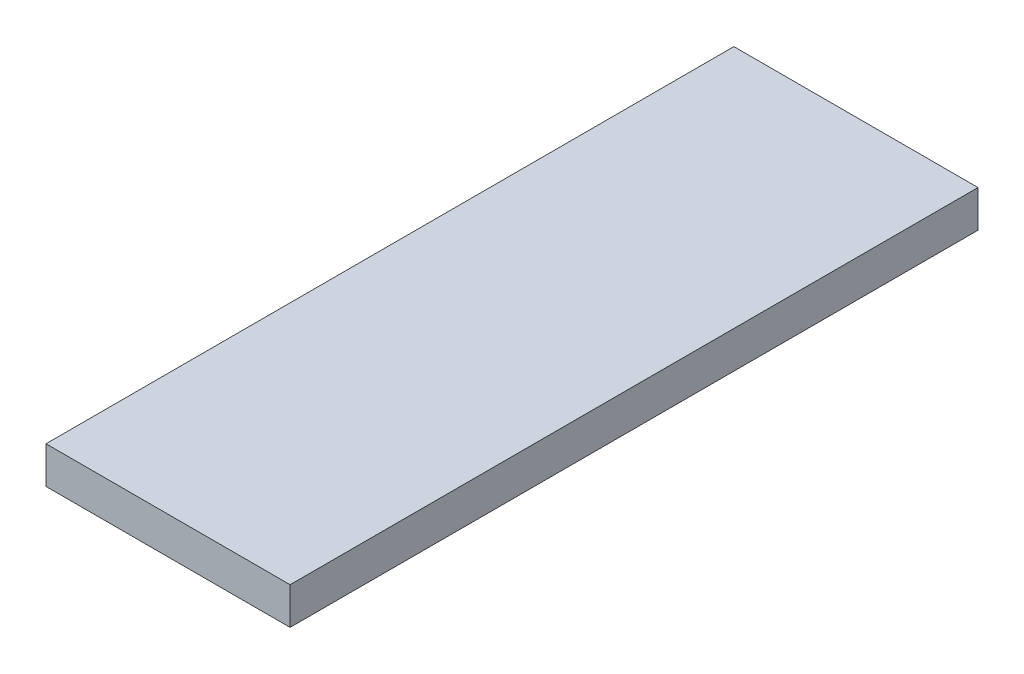
ISO-10303-21;
HEADER;
FILE_DESCRIPTION(('STEP AP214'),'2;1');
FILE_NAME('part.step','',(''),(''),'','','');
FILE_SCHEMA(('AUTOMOTIVE_DESIGN { 1 0 10303 214 1 1 1 1 }'));
ENDSEC;
DATA;
#1=APPLICATION_CONTEXT('core data for automotive mechanical design processes');
#2=APPLICATION_PROTOCOL_DEFINITION('international standard','automotive_design',2000,#1);
#3=PRODUCT_CONTEXT('',#1,'mechanical');
#4=PRODUCT('Part','Part','',(#3));
#5=PRODUCT_RELATED_PRODUCT_CATEGORY('part','',(#4));
#6=PRODUCT_DEFINITION_FORMATION('','',#4);
#7=PRODUCT_DEFINITION_CONTEXT('part definition',#1,'design');
#8=PRODUCT_DEFINITION('design','',#6,#7);
#9=PRODUCT_DEFINITION_SHAPE('','',#8);
#10=(LENGTH_UNIT() NAMED_UNIT(*) SI_UNIT(.MILLI.,.METRE.));
#11=(NAMED_UNIT(*) PLANE_ANGLE_UNIT() SI_UNIT($,.RADIAN.));
#12=(NAMED_UNIT(*) SI_UNIT($,.STERADIAN.) SOLID_ANGLE_UNIT());
#13=UNCERTAINTY_MEASURE_WITH_UNIT(LENGTH_MEASURE(1.E-05),#10,'distance_accuracy_value','');
#14=(GEOMETRIC_REPRESENTATION_CONTEXT(3) GLOBAL_UNCERTAINTY_ASSIGNED_CONTEXT((#13)) GLOBAL_UNIT_ASSIGNED_CONTEXT((#10,
#11,#12)) REPRESENTATION_CONTEXT('',''));
#15=CARTESIAN_POINT('',(0.,0.,0.));
#16=DIRECTION('',(0.,0.,1.));
#17=DIRECTION('',(1.,0.,0.));
#18=AXIS2_PLACEMENT_3D('',#15,#16,#17);
#19=CARTESIAN_POINT('',(-33.7161866295417,-13.2116628509933,93.));
#20=DIRECTION('',(1.,0.,0.));
#21=DIRECTION('',(0.,1.,0.));
#22=AXIS2_PLACEMENT_3D('',#19,#20,#21);
#23=PLANE('',#22);
#24=DIRECTION('',(0.,-1.,0.));
#25=VECTOR('',#24,1.);
#26=CARTESIAN_POINT('',(-33.7161866295417,-13.2116628509933,0.));
#27=LINE('',#26,#25);
#28=CARTESIAN_POINT('',(-33.7161866295417,-13.2116628509933,0.));
#29=VERTEX_POINT('',#28);
#30=CARTESIAN_POINT('',(-33.7161866295417,-18.2116628509933,0.));
#31=VERTEX_POINT('',#30);
#32=EDGE_CURVE('E96',#29,#31,#27,.T.);
#33=ORIENTED_EDGE('',*,*,#32,.T.);
#34=DIRECTION('',(0.,0.,-1.));
#35=VECTOR('',#34,1.);
#36=CARTESIAN_POINT('',(-33.7161866295417,-18.2116628509933,93.));
#37=LINE('',#36,#35);
#38=CARTESIAN_POINT('',(-33.7161866295417,-18.2116628509933,93.));
#39=VERTEX_POINT('',#38);
#40=EDGE_CURVE('E11',#39,#31,#37,.T.);
#41=ORIENTED_EDGE('',*,*,#40,.F.);
#42=DIRECTION('',(0.,-1.,0.));
#43=VECTOR('',#42,1.);
#44=CARTESIAN_POINT('',(-33.7161866295417,-13.2116628509933,93.));
#45=LINE('',#44,#43);
#46=CARTESIAN_POINT('',(-33.7161866295417,-13.2116628509933,93.));
#47=VERTEX_POINT('',#46);
#48=EDGE_CURVE('E84',#47,#39,#45,.T.);
#49=ORIENTED_EDGE('',*,*,#48,.F.);
#50=DIRECTION('',(0.,0.,-1.));
#51=VECTOR('',#50,1.);
#52=CARTESIAN_POINT('',(-33.7161866295417,-13.2116628509933,93.));
#53=LINE('',#52,#51);
#54=EDGE_CURVE('E92',#47,#29,#53,.T.);
#55=ORIENTED_EDGE('',*,*,#54,.T.);
#56=EDGE_LOOP('',(#33,#41,#49,#55));
#57=FACE_BOUND('',#56,.T.);
#58=ADVANCED_FACE('F33',(#57),#23,.F.);
#59=CARTESIAN_POINT('',(-33.7161866295417,-18.2116628509933,93.));
#60=DIRECTION('',(0.,1.,0.));
#61=DIRECTION('',(0.,0.,1.));
#62=AXIS2_PLACEMENT_3D('',#59,#60,#61);
#63=PLANE('',#62);
#64=DIRECTION('',(1.,0.,0.));
#65=VECTOR('',#64,1.);
#66=CARTESIAN_POINT('',(-33.7161866295417,-18.2116628509933,0.));
#67=LINE('',#66,#65);
#68=CARTESIAN_POINT('',(-0.716186629541725,-18.2116628509933,0.));
#69=VERTEX_POINT('',#68);
#70=EDGE_CURVE('E88',#31,#69,#67,.T.);
#71=ORIENTED_EDGE('',*,*,#70,.T.);
#72=DIRECTION('',(0.,0.,-1.));
#73=VECTOR('',#72,1.);
#74=CARTESIAN_POINT('',(-0.716186629541725,-18.2116628509933,93.));
#75=LINE('',#74,#73);
#76=CARTESIAN_POINT('',(-0.716186629541725,-18.2116628509933,93.));
#77=VERTEX_POINT('',#76);
#78=EDGE_CURVE('E41',#77,#69,#75,.T.);
#79=ORIENTED_EDGE('',*,*,#78,.F.);
#80=DIRECTION('',(1.,0.,0.));
#81=VECTOR('',#80,1.);
#82=CARTESIAN_POINT('',(-33.7161866295417,-18.2116628509933,93.));
#83=LINE('',#82,#81);
#84=EDGE_CURVE('E79',#39,#77,#83,.T.);
#85=ORIENTED_EDGE('',*,*,#84,.F.);
#86=ORIENTED_EDGE('',*,*,#40,.T.);
#87=EDGE_LOOP('',(#71,#79,#85,#86));
#88=FACE_BOUND('',#87,.T.);
#89=ADVANCED_FACE('F87',(#88),#63,.F.);
#90=CARTESIAN_POINT('',(-0.716186629541725,-13.2116628509933,93.));
#91=DIRECTION('',(-1.,0.,0.));
#92=DIRECTION('',(0.,0.,1.));
#93=AXIS2_PLACEMENT_3D('',#90,#91,#92);
#94=PLANE('',#93);
#95=DIRECTION('',(0.,1.,0.));
#96=VECTOR('',#95,1.);
#97=CARTESIAN_POINT('',(-0.716186629541725,-13.2116628509933,0.));
#98=LINE('',#97,#96);
#99=CARTESIAN_POINT('',(-0.716186629541725,-13.2116628509933,0.));
#100=VERTEX_POINT('',#99);
#101=EDGE_CURVE('E66',#69,#100,#98,.T.);
#102=ORIENTED_EDGE('',*,*,#101,.T.);
#103=DIRECTION('',(0.,0.,-1.));
#104=VECTOR('',#103,1.);
#105=CARTESIAN_POINT('',(-0.716186629541725,-13.2116628509933,93.));
#106=LINE('',#105,#104);
#107=CARTESIAN_POINT('',(-0.716186629541725,-13.2116628509933,93.));
#108=VERTEX_POINT('',#107);
#109=EDGE_CURVE('E89',#108,#100,#106,.T.);
#110=ORIENTED_EDGE('',*,*,#109,.F.);
#111=DIRECTION('',(0.,1.,0.));
#112=VECTOR('',#111,1.);
#113=CARTESIAN_POINT('',(-0.716186629541725,-13.2116628509933,93.));
#114=LINE('',#113,#112);
#115=EDGE_CURVE('E82',#77,#108,#114,.T.);
#116=ORIENTED_EDGE('',*,*,#115,.F.);
#117=ORIENTED_EDGE('',*,*,#78,.T.);
#118=EDGE_LOOP('',(#102,#110,#116,#117));
#119=FACE_BOUND('',#118,.T.);
#120=ADVANCED_FACE('F90',(#119),#94,.F.);
#121=CARTESIAN_POINT('',(-33.7161866295417,-13.2116628509933,93.));
#122=DIRECTION('',(0.,-1.,0.));
#123=DIRECTION('',(0.,0.,-1.));
#124=AXIS2_PLACEMENT_3D('',#121,#122,#123);
#125=PLANE('',#124);
#126=DIRECTION('',(-1.,0.,0.));
#127=VECTOR('',#126,1.);
#128=CARTESIAN_POINT('',(-33.7161866295417,-13.2116628509933,0.));
#129=LINE('',#128,#127);
#130=EDGE_CURVE('E72',#100,#29,#129,.T.);
#131=ORIENTED_EDGE('',*,*,#130,.T.);
#132=ORIENTED_EDGE('',*,*,#54,.F.);
#133=DIRECTION('',(-1.,0.,0.));
#134=VECTOR('',#133,1.);
#135=CARTESIAN_POINT('',(-33.7161866295417,-13.2116628509933,93.));
#136=LINE('',#135,#134);
#137=EDGE_CURVE('E49',#108,#47,#136,.T.);
#138=ORIENTED_EDGE('',*,*,#137,.F.);
#139=ORIENTED_EDGE('',*,*,#109,.T.);
#140=EDGE_LOOP('',(#131,#132,#138,#139));
#141=FACE_BOUND('',#140,.T.);
#142=ADVANCED_FACE('F103',(#141),#125,.F.);
#143=CARTESIAN_POINT('',(0.,0.,93.));
#144=DIRECTION('',(0.,0.,1.));
#145=DIRECTION('',(1.,0.,0.));
#146=AXIS2_PLACEMENT_3D('',#143,#144,#145);
#147=PLANE('',#146);
#148=ORIENTED_EDGE('',*,*,#48,.T.);
#149=ORIENTED_EDGE('',*,*,#84,.T.);
#150=ORIENTED_EDGE('',*,*,#115,.T.);
#151=ORIENTED_EDGE('',*,*,#137,.T.);
#152=EDGE_LOOP('',(#148,#149,#150,#151));
#153=FACE_BOUND('',#152,.T.);
#154=ADVANCED_FACE('F80',(#153),#147,.T.);
#155=CARTESIAN_POINT('',(0.,0.,0.));
#156=DIRECTION('',(0.,0.,1.));
#157=DIRECTION('',(1.,0.,0.));
#158=AXIS2_PLACEMENT_3D('',#155,#156,#157);
#159=PLANE('',#158);
#160=ORIENTED_EDGE('',*,*,#32,.F.);
#161=ORIENTED_EDGE('',*,*,#130,.F.);
#162=ORIENTED_EDGE('',*,*,#101,.F.);
#163=ORIENTED_EDGE('',*,*,#70,.F.);
#164=EDGE_LOOP('',(#160,#161,#162,#163));
#165=FACE_BOUND('',#164,.T.);
#166=ADVANCED_FACE('F106',(#165),#159,.F.);
#167=CLOSED_SHELL('',(#58,#89,#120,#142,#154,#166));
#168=MANIFOLD_SOLID_BREP('B2',#167);
#169=ADVANCED_BREP_SHAPE_REPRESENTATION('',(#18,#168),#14);
#170=SHAPE_DEFINITION_REPRESENTATION(#9,#169);
ENDSEC;
END-ISO-10303-21;
